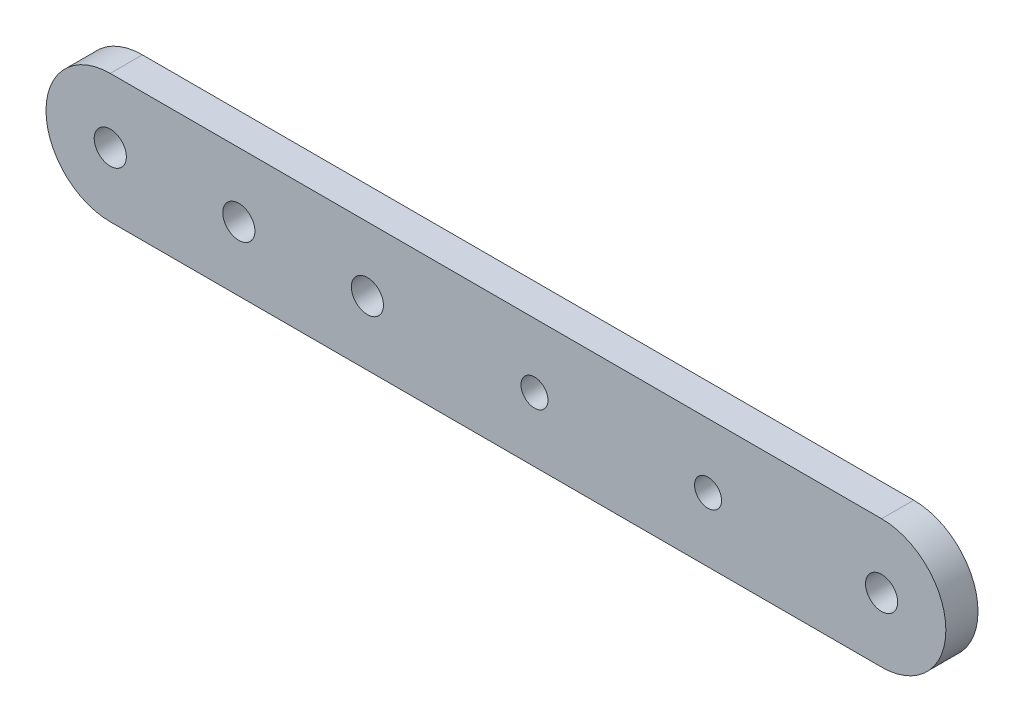
ISO-10303-21;
HEADER;
FILE_DESCRIPTION(('STEP AP214'),'2;1');
FILE_NAME('part.step','',(''),(''),'','','');
FILE_SCHEMA(('AUTOMOTIVE_DESIGN { 1 0 10303 214 1 1 1 1 }'));
ENDSEC;
DATA;
#1=APPLICATION_CONTEXT('core data for automotive mechanical design processes');
#2=APPLICATION_PROTOCOL_DEFINITION('international standard','automotive_design',2000,#1);
#3=PRODUCT_CONTEXT('',#1,'mechanical');
#4=PRODUCT('Part','Part','',(#3));
#5=PRODUCT_RELATED_PRODUCT_CATEGORY('part','',(#4));
#6=PRODUCT_DEFINITION_FORMATION('','',#4);
#7=PRODUCT_DEFINITION_CONTEXT('part definition',#1,'design');
#8=PRODUCT_DEFINITION('design','',#6,#7);
#9=PRODUCT_DEFINITION_SHAPE('','',#8);
#10=(LENGTH_UNIT() NAMED_UNIT(*) SI_UNIT(.MILLI.,.METRE.));
#11=(NAMED_UNIT(*) PLANE_ANGLE_UNIT() SI_UNIT($,.RADIAN.));
#12=(NAMED_UNIT(*) SI_UNIT($,.STERADIAN.) SOLID_ANGLE_UNIT());
#13=UNCERTAINTY_MEASURE_WITH_UNIT(LENGTH_MEASURE(1.E-05),#10,'distance_accuracy_value','');
#14=(GEOMETRIC_REPRESENTATION_CONTEXT(3) GLOBAL_UNCERTAINTY_ASSIGNED_CONTEXT((#13)) GLOBAL_UNIT_ASSIGNED_CONTEXT((#10,
#11,#12)) REPRESENTATION_CONTEXT('',''));
#15=CARTESIAN_POINT('',(0.,0.,0.));
#16=DIRECTION('',(0.,0.,1.));
#17=DIRECTION('',(1.,0.,0.));
#18=AXIS2_PLACEMENT_3D('',#15,#16,#17);
#19=CARTESIAN_POINT('',(60.,0.,5.));
#20=DIRECTION('',(0.,0.,1.));
#21=DIRECTION('',(1.,0.,0.));
#22=AXIS2_PLACEMENT_3D('',#19,#20,#21);
#23=PLANE('',#22);
#24=CARTESIAN_POINT('',(60.,0.,5.));
#25=DIRECTION('',(0.,0.,1.));
#26=DIRECTION('',(1.,0.,0.));
#27=AXIS2_PLACEMENT_3D('',#24,#25,#26);
#28=CIRCLE('',#27,2.5);
#29=CARTESIAN_POINT('',(62.5,0.,5.));
#30=VERTEX_POINT('',#29);
#31=EDGE_CURVE('E130',#30,#30,#28,.T.);
#32=ORIENTED_EDGE('',*,*,#31,.F.);
#33=EDGE_LOOP('',(#32));
#34=FACE_BOUND('',#33,.T.);
#35=CARTESIAN_POINT('',(-40.,0.,5.));
#36=DIRECTION('',(0.,0.,1.));
#37=DIRECTION('',(1.,0.,0.));
#38=AXIS2_PLACEMENT_3D('',#35,#36,#37);
#39=CIRCLE('',#38,2.5);
#40=CARTESIAN_POINT('',(-37.5,0.,5.));
#41=VERTEX_POINT('',#40);
#42=EDGE_CURVE('E118',#41,#41,#39,.T.);
#43=ORIENTED_EDGE('',*,*,#42,.F.);
#44=EDGE_LOOP('',(#43));
#45=FACE_BOUND('',#44,.T.);
#46=CARTESIAN_POINT('',(33.,0.,5.));
#47=DIRECTION('',(0.,0.,1.));
#48=DIRECTION('',(1.,0.,0.));
#49=AXIS2_PLACEMENT_3D('',#46,#47,#48);
#50=CIRCLE('',#49,2.10000000000002);
#51=CARTESIAN_POINT('',(35.1,0.,5.));
#52=VERTEX_POINT('',#51);
#53=EDGE_CURVE('E97',#52,#52,#50,.T.);
#54=ORIENTED_EDGE('',*,*,#53,.F.);
#55=EDGE_LOOP('',(#54));
#56=FACE_BOUND('',#55,.T.);
#57=CARTESIAN_POINT('',(60.,0.,5.));
#58=DIRECTION('',(0.,0.,1.));
#59=DIRECTION('',(1.,0.,0.));
#60=AXIS2_PLACEMENT_3D('',#57,#58,#59);
#61=CIRCLE('',#60,10.0000000000001);
#62=CARTESIAN_POINT('',(60.,-10.,5.));
#63=VERTEX_POINT('',#62);
#64=CARTESIAN_POINT('',(60.,10.0000000000001,5.));
#65=VERTEX_POINT('',#64);
#66=EDGE_CURVE('E82',#63,#65,#61,.T.);
#67=ORIENTED_EDGE('',*,*,#66,.T.);
#68=DIRECTION('',(-1.,0.,0.));
#69=VECTOR('',#68,1.);
#70=CARTESIAN_POINT('',(60.,10.0000000000001,5.));
#71=LINE('',#70,#69);
#72=CARTESIAN_POINT('',(-60.,10.,5.));
#73=VERTEX_POINT('',#72);
#74=EDGE_CURVE('E77',#65,#73,#71,.T.);
#75=ORIENTED_EDGE('',*,*,#74,.T.);
#76=CARTESIAN_POINT('',(-60.,0.,5.));
#77=DIRECTION('',(0.,0.,1.));
#78=DIRECTION('',(1.,0.,0.));
#79=AXIS2_PLACEMENT_3D('',#76,#77,#78);
#80=CIRCLE('',#79,10.);
#81=CARTESIAN_POINT('',(-60.,-9.99999999999999,5.));
#82=VERTEX_POINT('',#81);
#83=EDGE_CURVE('E80',#73,#82,#80,.T.);
#84=ORIENTED_EDGE('',*,*,#83,.T.);
#85=DIRECTION('',(1.,0.,0.));
#86=VECTOR('',#85,1.);
#87=CARTESIAN_POINT('',(-60.,-9.99999999999999,5.));
#88=LINE('',#87,#86);
#89=EDGE_CURVE('E47',#82,#63,#88,.T.);
#90=ORIENTED_EDGE('',*,*,#89,.T.);
#91=EDGE_LOOP('',(#67,#75,#84,#90));
#92=FACE_BOUND('',#91,.T.);
#93=CARTESIAN_POINT('',(6.00000000000001,0.,5.));
#94=DIRECTION('',(0.,0.,1.));
#95=DIRECTION('',(1.,0.,0.));
#96=AXIS2_PLACEMENT_3D('',#93,#94,#95);
#97=CIRCLE('',#96,2.10000000000001);
#98=CARTESIAN_POINT('',(8.10000000000003,0.,5.));
#99=VERTEX_POINT('',#98);
#100=EDGE_CURVE('E112',#99,#99,#97,.T.);
#101=ORIENTED_EDGE('',*,*,#100,.F.);
#102=EDGE_LOOP('',(#101));
#103=FACE_BOUND('',#102,.T.);
#104=CARTESIAN_POINT('',(-20.,0.,5.));
#105=DIRECTION('',(0.,0.,1.));
#106=DIRECTION('',(1.,0.,0.));
#107=AXIS2_PLACEMENT_3D('',#104,#105,#106);
#108=CIRCLE('',#107,2.5);
#109=CARTESIAN_POINT('',(-17.5,0.,5.));
#110=VERTEX_POINT('',#109);
#111=EDGE_CURVE('E124',#110,#110,#108,.T.);
#112=ORIENTED_EDGE('',*,*,#111,.F.);
#113=EDGE_LOOP('',(#112));
#114=FACE_BOUND('',#113,.T.);
#115=CARTESIAN_POINT('',(-60.,0.,5.));
#116=DIRECTION('',(0.,0.,1.));
#117=DIRECTION('',(1.,0.,0.));
#118=AXIS2_PLACEMENT_3D('',#115,#116,#117);
#119=CIRCLE('',#118,2.5);
#120=CARTESIAN_POINT('',(-57.5,0.,5.));
#121=VERTEX_POINT('',#120);
#122=EDGE_CURVE('E136',#121,#121,#119,.T.);
#123=ORIENTED_EDGE('',*,*,#122,.F.);
#124=EDGE_LOOP('',(#123));
#125=FACE_BOUND('',#124,.T.);
#126=ADVANCED_FACE('F30',(#34,#45,#56,#92,#103,#114,#125),#23,.T.);
#127=CARTESIAN_POINT('',(60.,0.,0.));
#128=DIRECTION('',(0.,0.,1.));
#129=DIRECTION('',(1.,0.,0.));
#130=AXIS2_PLACEMENT_3D('',#127,#128,#129);
#131=PLANE('',#130);
#132=CARTESIAN_POINT('',(60.,0.,0.));
#133=DIRECTION('',(0.,0.,1.));
#134=DIRECTION('',(1.,0.,0.));
#135=AXIS2_PLACEMENT_3D('',#132,#133,#134);
#136=CIRCLE('',#135,2.5);
#137=CARTESIAN_POINT('',(62.5,0.,0.));
#138=VERTEX_POINT('',#137);
#139=EDGE_CURVE('E133',#138,#138,#136,.T.);
#140=ORIENTED_EDGE('',*,*,#139,.T.);
#141=EDGE_LOOP('',(#140));
#142=FACE_BOUND('',#141,.T.);
#143=CARTESIAN_POINT('',(-40.,0.,0.));
#144=DIRECTION('',(0.,0.,1.));
#145=DIRECTION('',(1.,0.,0.));
#146=AXIS2_PLACEMENT_3D('',#143,#144,#145);
#147=CIRCLE('',#146,2.5);
#148=CARTESIAN_POINT('',(-37.5,0.,0.));
#149=VERTEX_POINT('',#148);
#150=EDGE_CURVE('E121',#149,#149,#147,.T.);
#151=ORIENTED_EDGE('',*,*,#150,.T.);
#152=EDGE_LOOP('',(#151));
#153=FACE_BOUND('',#152,.T.);
#154=CARTESIAN_POINT('',(33.,0.,0.));
#155=DIRECTION('',(0.,0.,1.));
#156=DIRECTION('',(1.,0.,0.));
#157=AXIS2_PLACEMENT_3D('',#154,#155,#156);
#158=CIRCLE('',#157,2.10000000000002);
#159=CARTESIAN_POINT('',(35.1,0.,0.));
#160=VERTEX_POINT('',#159);
#161=EDGE_CURVE('E109',#160,#160,#158,.T.);
#162=ORIENTED_EDGE('',*,*,#161,.T.);
#163=EDGE_LOOP('',(#162));
#164=FACE_BOUND('',#163,.T.);
#165=CARTESIAN_POINT('',(60.,0.,0.));
#166=DIRECTION('',(0.,0.,1.));
#167=DIRECTION('',(1.,0.,0.));
#168=AXIS2_PLACEMENT_3D('',#165,#166,#167);
#169=CIRCLE('',#168,10.0000000000001);
#170=CARTESIAN_POINT('',(60.,-10.,0.));
#171=VERTEX_POINT('',#170);
#172=CARTESIAN_POINT('',(60.,10.0000000000001,0.));
#173=VERTEX_POINT('',#172);
#174=EDGE_CURVE('E94',#171,#173,#169,.T.);
#175=ORIENTED_EDGE('',*,*,#174,.F.);
#176=DIRECTION('',(1.,0.,0.));
#177=VECTOR('',#176,1.);
#178=CARTESIAN_POINT('',(-60.,-9.99999999999999,0.));
#179=LINE('',#178,#177);
#180=CARTESIAN_POINT('',(-60.,-9.99999999999999,0.));
#181=VERTEX_POINT('',#180);
#182=EDGE_CURVE('E70',#181,#171,#179,.T.);
#183=ORIENTED_EDGE('',*,*,#182,.F.);
#184=CARTESIAN_POINT('',(-60.,0.,0.));
#185=DIRECTION('',(0.,0.,1.));
#186=DIRECTION('',(1.,0.,0.));
#187=AXIS2_PLACEMENT_3D('',#184,#185,#186);
#188=CIRCLE('',#187,10.);
#189=CARTESIAN_POINT('',(-60.,10.,0.));
#190=VERTEX_POINT('',#189);
#191=EDGE_CURVE('E64',#190,#181,#188,.T.);
#192=ORIENTED_EDGE('',*,*,#191,.F.);
#193=DIRECTION('',(-1.,0.,0.));
#194=VECTOR('',#193,1.);
#195=CARTESIAN_POINT('',(60.,10.0000000000001,0.));
#196=LINE('',#195,#194);
#197=EDGE_CURVE('E86',#173,#190,#196,.T.);
#198=ORIENTED_EDGE('',*,*,#197,.F.);
#199=EDGE_LOOP('',(#175,#183,#192,#198));
#200=FACE_BOUND('',#199,.T.);
#201=CARTESIAN_POINT('',(6.00000000000001,0.,0.));
#202=DIRECTION('',(0.,0.,1.));
#203=DIRECTION('',(1.,0.,0.));
#204=AXIS2_PLACEMENT_3D('',#201,#202,#203);
#205=CIRCLE('',#204,2.10000000000001);
#206=CARTESIAN_POINT('',(8.10000000000003,0.,0.));
#207=VERTEX_POINT('',#206);
#208=EDGE_CURVE('E115',#207,#207,#205,.T.);
#209=ORIENTED_EDGE('',*,*,#208,.T.);
#210=EDGE_LOOP('',(#209));
#211=FACE_BOUND('',#210,.T.);
#212=CARTESIAN_POINT('',(-20.,0.,0.));
#213=DIRECTION('',(0.,0.,1.));
#214=DIRECTION('',(1.,0.,0.));
#215=AXIS2_PLACEMENT_3D('',#212,#213,#214);
#216=CIRCLE('',#215,2.5);
#217=CARTESIAN_POINT('',(-17.5,0.,0.));
#218=VERTEX_POINT('',#217);
#219=EDGE_CURVE('E127',#218,#218,#216,.T.);
#220=ORIENTED_EDGE('',*,*,#219,.T.);
#221=EDGE_LOOP('',(#220));
#222=FACE_BOUND('',#221,.T.);
#223=CARTESIAN_POINT('',(-60.,0.,0.));
#224=DIRECTION('',(0.,0.,1.));
#225=DIRECTION('',(1.,0.,0.));
#226=AXIS2_PLACEMENT_3D('',#223,#224,#225);
#227=CIRCLE('',#226,2.5);
#228=CARTESIAN_POINT('',(-57.5,0.,0.));
#229=VERTEX_POINT('',#228);
#230=EDGE_CURVE('E139',#229,#229,#227,.T.);
#231=ORIENTED_EDGE('',*,*,#230,.T.);
#232=EDGE_LOOP('',(#231));
#233=FACE_BOUND('',#232,.T.);
#234=ADVANCED_FACE('F105',(#142,#153,#164,#200,#211,#222,#233),#131,.F.);
#235=CARTESIAN_POINT('',(60.,0.,5.));
#236=DIRECTION('',(0.,0.,-1.));
#237=DIRECTION('',(-1.,0.,0.));
#238=AXIS2_PLACEMENT_3D('',#235,#236,#237);
#239=CYLINDRICAL_SURFACE('',#238,10.0000000000001);
#240=ORIENTED_EDGE('',*,*,#174,.T.);
#241=DIRECTION('',(0.,0.,-1.));
#242=VECTOR('',#241,1.);
#243=CARTESIAN_POINT('',(60.,10.0000000000001,5.));
#244=LINE('',#243,#242);
#245=EDGE_CURVE('E11',#65,#173,#244,.T.);
#246=ORIENTED_EDGE('',*,*,#245,.F.);
#247=ORIENTED_EDGE('',*,*,#66,.F.);
#248=DIRECTION('',(0.,0.,-1.));
#249=VECTOR('',#248,1.);
#250=CARTESIAN_POINT('',(60.,-10.,5.));
#251=LINE('',#250,#249);
#252=EDGE_CURVE('E90',#63,#171,#251,.T.);
#253=ORIENTED_EDGE('',*,*,#252,.T.);
#254=EDGE_LOOP('',(#240,#246,#247,#253));
#255=FACE_BOUND('',#254,.T.);
#256=ADVANCED_FACE('F32',(#255),#239,.T.);
#257=CARTESIAN_POINT('',(60.,10.0000000000001,5.));
#258=DIRECTION('',(0.,-1.,0.));
#259=DIRECTION('',(1.,0.,0.));
#260=AXIS2_PLACEMENT_3D('',#257,#258,#259);
#261=PLANE('',#260);
#262=ORIENTED_EDGE('',*,*,#197,.T.);
#263=DIRECTION('',(0.,0.,-1.));
#264=VECTOR('',#263,1.);
#265=CARTESIAN_POINT('',(-60.,10.,5.));
#266=LINE('',#265,#264);
#267=EDGE_CURVE('E39',#73,#190,#266,.T.);
#268=ORIENTED_EDGE('',*,*,#267,.F.);
#269=ORIENTED_EDGE('',*,*,#74,.F.);
#270=ORIENTED_EDGE('',*,*,#245,.T.);
#271=EDGE_LOOP('',(#262,#268,#269,#270));
#272=FACE_BOUND('',#271,.T.);
#273=ADVANCED_FACE('F85',(#272),#261,.F.);
#274=CARTESIAN_POINT('',(-60.,0.,5.));
#275=DIRECTION('',(0.,0.,-1.));
#276=DIRECTION('',(-1.,0.,0.));
#277=AXIS2_PLACEMENT_3D('',#274,#275,#276);
#278=CYLINDRICAL_SURFACE('',#277,10.);
#279=ORIENTED_EDGE('',*,*,#191,.T.);
#280=DIRECTION('',(0.,0.,-1.));
#281=VECTOR('',#280,1.);
#282=CARTESIAN_POINT('',(-60.,-9.99999999999999,5.));
#283=LINE('',#282,#281);
#284=EDGE_CURVE('E87',#82,#181,#283,.T.);
#285=ORIENTED_EDGE('',*,*,#284,.F.);
#286=ORIENTED_EDGE('',*,*,#83,.F.);
#287=ORIENTED_EDGE('',*,*,#267,.T.);
#288=EDGE_LOOP('',(#279,#285,#286,#287));
#289=FACE_BOUND('',#288,.T.);
#290=ADVANCED_FACE('F88',(#289),#278,.T.);
#291=CARTESIAN_POINT('',(-60.,-9.99999999999999,5.));
#292=DIRECTION('',(0.,1.,0.));
#293=DIRECTION('',(-1.,0.,0.));
#294=AXIS2_PLACEMENT_3D('',#291,#292,#293);
#295=PLANE('',#294);
#296=ORIENTED_EDGE('',*,*,#182,.T.);
#297=ORIENTED_EDGE('',*,*,#252,.F.);
#298=ORIENTED_EDGE('',*,*,#89,.F.);
#299=ORIENTED_EDGE('',*,*,#284,.T.);
#300=EDGE_LOOP('',(#296,#297,#298,#299));
#301=FACE_BOUND('',#300,.T.);
#302=ADVANCED_FACE('F102',(#301),#295,.F.);
#303=CARTESIAN_POINT('',(33.,0.,5.));
#304=DIRECTION('',(0.,0.,-1.));
#305=DIRECTION('',(-1.,0.,0.));
#306=AXIS2_PLACEMENT_3D('',#303,#304,#305);
#307=CYLINDRICAL_SURFACE('',#306,2.10000000000002);
#308=ORIENTED_EDGE('',*,*,#53,.T.);
#309=EDGE_LOOP('',(#308));
#310=FACE_BOUND('',#309,.T.);
#311=ORIENTED_EDGE('',*,*,#161,.F.);
#312=EDGE_LOOP('',(#311));
#313=FACE_BOUND('',#312,.T.);
#314=ADVANCED_FACE('F159',(#310,#313),#307,.F.);
#315=CARTESIAN_POINT('',(6.00000000000001,0.,5.));
#316=DIRECTION('',(0.,0.,-1.));
#317=DIRECTION('',(-1.,0.,0.));
#318=AXIS2_PLACEMENT_3D('',#315,#316,#317);
#319=CYLINDRICAL_SURFACE('',#318,2.10000000000001);
#320=ORIENTED_EDGE('',*,*,#100,.T.);
#321=EDGE_LOOP('',(#320));
#322=FACE_BOUND('',#321,.T.);
#323=ORIENTED_EDGE('',*,*,#208,.F.);
#324=EDGE_LOOP('',(#323));
#325=FACE_BOUND('',#324,.T.);
#326=ADVANCED_FACE('F205',(#322,#325),#319,.F.);
#327=CARTESIAN_POINT('',(-40.,0.,5.));
#328=DIRECTION('',(0.,0.,-1.));
#329=DIRECTION('',(-1.,0.,0.));
#330=AXIS2_PLACEMENT_3D('',#327,#328,#329);
#331=CYLINDRICAL_SURFACE('',#330,2.5);
#332=ORIENTED_EDGE('',*,*,#42,.T.);
#333=EDGE_LOOP('',(#332));
#334=FACE_BOUND('',#333,.T.);
#335=ORIENTED_EDGE('',*,*,#150,.F.);
#336=EDGE_LOOP('',(#335));
#337=FACE_BOUND('',#336,.T.);
#338=ADVANCED_FACE('F213',(#334,#337),#331,.F.);
#339=CARTESIAN_POINT('',(-20.,0.,5.));
#340=DIRECTION('',(0.,0.,-1.));
#341=DIRECTION('',(-1.,0.,0.));
#342=AXIS2_PLACEMENT_3D('',#339,#340,#341);
#343=CYLINDRICAL_SURFACE('',#342,2.5);
#344=ORIENTED_EDGE('',*,*,#111,.T.);
#345=EDGE_LOOP('',(#344));
#346=FACE_BOUND('',#345,.T.);
#347=ORIENTED_EDGE('',*,*,#219,.F.);
#348=EDGE_LOOP('',(#347));
#349=FACE_BOUND('',#348,.T.);
#350=ADVANCED_FACE('F221',(#346,#349),#343,.F.);
#351=CARTESIAN_POINT('',(60.,0.,5.));
#352=DIRECTION('',(0.,0.,-1.));
#353=DIRECTION('',(-1.,0.,0.));
#354=AXIS2_PLACEMENT_3D('',#351,#352,#353);
#355=CYLINDRICAL_SURFACE('',#354,2.5);
#356=ORIENTED_EDGE('',*,*,#31,.T.);
#357=EDGE_LOOP('',(#356));
#358=FACE_BOUND('',#357,.T.);
#359=ORIENTED_EDGE('',*,*,#139,.F.);
#360=EDGE_LOOP('',(#359));
#361=FACE_BOUND('',#360,.T.);
#362=ADVANCED_FACE('F230',(#358,#361),#355,.F.);
#363=CARTESIAN_POINT('',(-60.,0.,5.));
#364=DIRECTION('',(0.,0.,-1.));
#365=DIRECTION('',(-1.,0.,0.));
#366=AXIS2_PLACEMENT_3D('',#363,#364,#365);
#367=CYLINDRICAL_SURFACE('',#366,2.5);
#368=ORIENTED_EDGE('',*,*,#122,.T.);
#369=EDGE_LOOP('',(#368));
#370=FACE_BOUND('',#369,.T.);
#371=ORIENTED_EDGE('',*,*,#230,.F.);
#372=EDGE_LOOP('',(#371));
#373=FACE_BOUND('',#372,.T.);
#374=ADVANCED_FACE('F145',(#370,#373),#367,.F.);
#375=CLOSED_SHELL('',(#126,#234,#256,#273,#290,#302,#314,#326,#338,#350,#362,#374));
#376=MANIFOLD_SOLID_BREP('B2',#375);
#377=ADVANCED_BREP_SHAPE_REPRESENTATION('',(#18,#376),#14);
#378=SHAPE_DEFINITION_REPRESENTATION(#9,#377);
ENDSEC;
END-ISO-10303-21;
